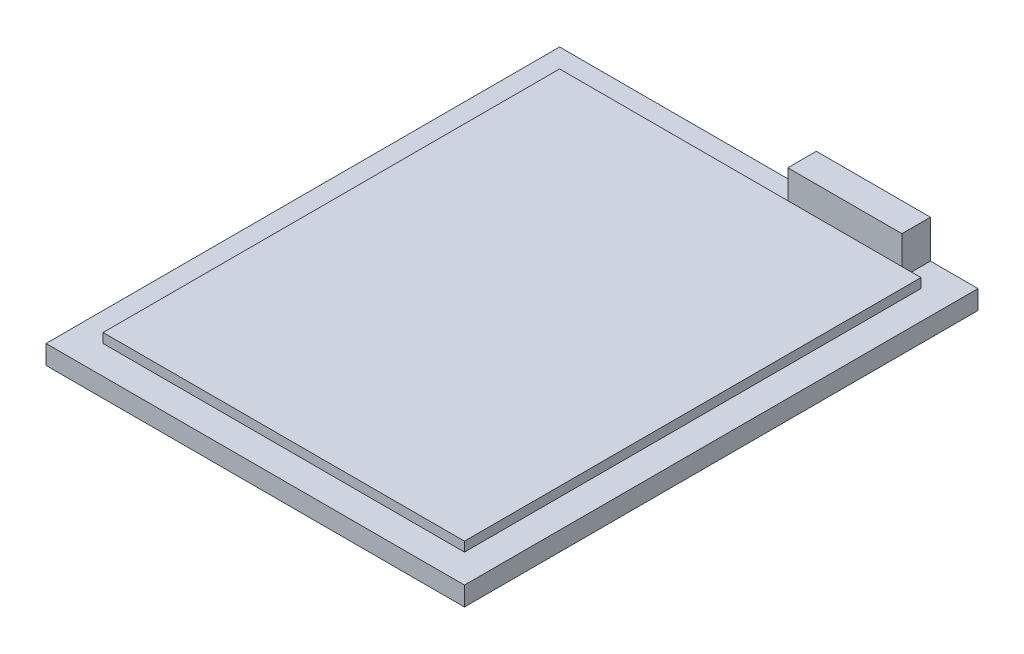
ISO-10303-21;
HEADER;
FILE_DESCRIPTION(('STEP AP214'),'2;1');
FILE_NAME('part.step','',(''),(''),'','','');
FILE_SCHEMA(('AUTOMOTIVE_DESIGN { 1 0 10303 214 1 1 1 1 }'));
ENDSEC;
DATA;
#1=APPLICATION_CONTEXT('core data for automotive mechanical design processes');
#2=APPLICATION_PROTOCOL_DEFINITION('international standard','automotive_design',2000,#1);
#3=PRODUCT_CONTEXT('',#1,'mechanical');
#4=PRODUCT('Part','Part','',(#3));
#5=PRODUCT_RELATED_PRODUCT_CATEGORY('part','',(#4));
#6=PRODUCT_DEFINITION_FORMATION('','',#4);
#7=PRODUCT_DEFINITION_CONTEXT('part definition',#1,'design');
#8=PRODUCT_DEFINITION('design','',#6,#7);
#9=PRODUCT_DEFINITION_SHAPE('','',#8);
#10=(LENGTH_UNIT() NAMED_UNIT(*) SI_UNIT(.MILLI.,.METRE.));
#11=(NAMED_UNIT(*) PLANE_ANGLE_UNIT() SI_UNIT($,.RADIAN.));
#12=(NAMED_UNIT(*) SI_UNIT($,.STERADIAN.) SOLID_ANGLE_UNIT());
#13=UNCERTAINTY_MEASURE_WITH_UNIT(LENGTH_MEASURE(1.E-05),#10,'distance_accuracy_value','');
#14=(GEOMETRIC_REPRESENTATION_CONTEXT(3) GLOBAL_UNCERTAINTY_ASSIGNED_CONTEXT((#13)) GLOBAL_UNIT_ASSIGNED_CONTEXT((#10,
#11,#12)) REPRESENTATION_CONTEXT('',''));
#15=CARTESIAN_POINT('',(0.,0.,0.));
#16=DIRECTION('',(0.,0.,1.));
#17=DIRECTION('',(1.,0.,0.));
#18=AXIS2_PLACEMENT_3D('',#15,#16,#17);
#19=CARTESIAN_POINT('',(0.,2.,0.));
#20=DIRECTION('',(0.,1.,0.));
#21=DIRECTION('',(0.,0.,1.));
#22=AXIS2_PLACEMENT_3D('',#19,#20,#21);
#23=PLANE('',#22);
#24=DIRECTION('',(-1.,0.,0.));
#25=VECTOR('',#24,1.);
#26=CARTESIAN_POINT('',(-9.07192629460979,2.,-15.9701698915296));
#27=LINE('',#26,#25);
#28=CARTESIAN_POINT('',(14.9280737053902,2.,-15.9701698915296));
#29=VERTEX_POINT('',#28);
#30=CARTESIAN_POINT('',(-9.07192629460979,2.,-15.9701698915296));
#31=VERTEX_POINT('',#30);
#32=EDGE_CURVE('E175',#29,#31,#27,.T.);
#33=ORIENTED_EDGE('',*,*,#32,.F.);
#34=DIRECTION('',(0.,0.,1.));
#35=VECTOR('',#34,1.);
#36=CARTESIAN_POINT('',(14.9280737053902,2.,-15.9701698915296));
#37=LINE('',#36,#35);
#38=CARTESIAN_POINT('',(14.9280737053902,2.,-18.9701698915296));
#39=VERTEX_POINT('',#38);
#40=EDGE_CURVE('E233',#39,#29,#37,.T.);
#41=ORIENTED_EDGE('',*,*,#40,.F.);
#42=DIRECTION('',(-1.,0.,0.));
#43=VECTOR('',#42,1.);
#44=CARTESIAN_POINT('',(-12.0719262946098,2.,-18.9701698915296));
#45=LINE('',#44,#43);
#46=CARTESIAN_POINT('',(-12.0719262946098,2.,-18.9701698915296));
#47=VERTEX_POINT('',#46);
#48=EDGE_CURVE('E194',#39,#47,#45,.T.);
#49=ORIENTED_EDGE('',*,*,#48,.T.);
#50=DIRECTION('',(0.,0.,1.));
#51=VECTOR('',#50,1.);
#52=CARTESIAN_POINT('',(-12.0719262946098,2.,-18.9701698915296));
#53=LINE('',#52,#51);
#54=CARTESIAN_POINT('',(-12.0719262946098,2.,35.0298301084704));
#55=VERTEX_POINT('',#54);
#56=EDGE_CURVE('E186',#47,#55,#53,.T.);
#57=ORIENTED_EDGE('',*,*,#56,.T.);
#58=DIRECTION('',(1.,0.,0.));
#59=VECTOR('',#58,1.);
#60=CARTESIAN_POINT('',(-12.0719262946098,2.,35.0298301084704));
#61=LINE('',#60,#59);
#62=CARTESIAN_POINT('',(31.9280737053902,2.,35.0298301084704));
#63=VERTEX_POINT('',#62);
#64=EDGE_CURVE('E189',#55,#63,#61,.T.);
#65=ORIENTED_EDGE('',*,*,#64,.T.);
#66=DIRECTION('',(0.,0.,-1.));
#67=VECTOR('',#66,1.);
#68=CARTESIAN_POINT('',(31.9280737053902,2.,-18.9701698915296));
#69=LINE('',#68,#67);
#70=CARTESIAN_POINT('',(31.9280737053902,2.,-18.9701698915296));
#71=VERTEX_POINT('',#70);
#72=EDGE_CURVE('E192',#63,#71,#69,.T.);
#73=ORIENTED_EDGE('',*,*,#72,.T.);
#74=CARTESIAN_POINT('',(26.9280737053902,2.,-18.9701698915296));
#75=VERTEX_POINT('',#74);
#76=EDGE_CURVE('E195',#71,#75,#45,.T.);
#77=ORIENTED_EDGE('',*,*,#76,.T.);
#78=DIRECTION('',(0.,0.,-1.));
#79=VECTOR('',#78,1.);
#80=CARTESIAN_POINT('',(26.9280737053902,2.,-15.9701698915296));
#81=LINE('',#80,#79);
#82=CARTESIAN_POINT('',(26.9280737053902,2.,-15.9701698915296));
#83=VERTEX_POINT('',#82);
#84=EDGE_CURVE('E144',#83,#75,#81,.T.);
#85=ORIENTED_EDGE('',*,*,#84,.F.);
#86=CARTESIAN_POINT('',(28.9280737053902,2.,-15.9701698915296));
#87=VERTEX_POINT('',#86);
#88=EDGE_CURVE('E162',#87,#83,#27,.T.);
#89=ORIENTED_EDGE('',*,*,#88,.F.);
#90=DIRECTION('',(0.,0.,-1.));
#91=VECTOR('',#90,1.);
#92=CARTESIAN_POINT('',(28.9280737053902,2.,-15.9701698915296));
#93=LINE('',#92,#91);
#94=CARTESIAN_POINT('',(28.9280737053902,2.,32.0298301084704));
#95=VERTEX_POINT('',#94);
#96=EDGE_CURVE('E173',#95,#87,#93,.T.);
#97=ORIENTED_EDGE('',*,*,#96,.F.);
#98=DIRECTION('',(1.,0.,0.));
#99=VECTOR('',#98,1.);
#100=CARTESIAN_POINT('',(-9.07192629460979,2.,32.0298301084704));
#101=LINE('',#100,#99);
#102=CARTESIAN_POINT('',(-9.07192629460979,2.,32.0298301084704));
#103=VERTEX_POINT('',#102);
#104=EDGE_CURVE('E153',#103,#95,#101,.T.);
#105=ORIENTED_EDGE('',*,*,#104,.F.);
#106=DIRECTION('',(0.,0.,1.));
#107=VECTOR('',#106,1.);
#108=CARTESIAN_POINT('',(-9.07192629460979,2.,-15.9701698915296));
#109=LINE('',#108,#107);
#110=EDGE_CURVE('E150',#31,#103,#109,.T.);
#111=ORIENTED_EDGE('',*,*,#110,.F.);
#112=EDGE_LOOP('',(#33,#41,#49,#57,#65,#73,#77,#85,#89,#97,#105,#111));
#113=FACE_BOUND('',#112,.T.);
#114=ADVANCED_FACE('F33',(#113),#23,.T.);
#115=CARTESIAN_POINT('',(-9.07192629460979,3.,-15.9701698915296));
#116=DIRECTION('',(0.,0.,1.));
#117=DIRECTION('',(1.,0.,0.));
#118=AXIS2_PLACEMENT_3D('',#115,#116,#117);
#119=PLANE('',#118);
#120=DIRECTION('',(0.,-1.,0.));
#121=VECTOR('',#120,1.);
#122=CARTESIAN_POINT('',(14.9280737053902,6.,-15.9701698915296));
#123=LINE('',#122,#121);
#124=CARTESIAN_POINT('',(14.9280737053902,3.,-15.9701698915296));
#125=VERTEX_POINT('',#124);
#126=EDGE_CURVE('E148',#125,#29,#123,.T.);
#127=ORIENTED_EDGE('',*,*,#126,.T.);
#128=ORIENTED_EDGE('',*,*,#32,.T.);
#129=DIRECTION('',(0.,-1.,0.));
#130=VECTOR('',#129,1.);
#131=CARTESIAN_POINT('',(-9.07192629460979,3.,-15.9701698915296));
#132=LINE('',#131,#130);
#133=CARTESIAN_POINT('',(-9.07192629460979,3.,-15.9701698915296));
#134=VERTEX_POINT('',#133);
#135=EDGE_CURVE('E169',#134,#31,#132,.T.);
#136=ORIENTED_EDGE('',*,*,#135,.F.);
#137=DIRECTION('',(-1.,0.,0.));
#138=VECTOR('',#137,1.);
#139=CARTESIAN_POINT('',(-9.07192629460979,3.,-15.9701698915296));
#140=LINE('',#139,#138);
#141=EDGE_CURVE('E166',#125,#134,#140,.T.);
#142=ORIENTED_EDGE('',*,*,#141,.F.);
#143=EDGE_LOOP('',(#127,#128,#136,#142));
#144=FACE_BOUND('',#143,.T.);
#145=ADVANCED_FACE('F268',(#144),#119,.F.);
#146=DIRECTION('',(0.,-1.,0.));
#147=VECTOR('',#146,1.);
#148=CARTESIAN_POINT('',(26.9280737053902,6.,-15.9701698915296));
#149=LINE('',#148,#147);
#150=CARTESIAN_POINT('',(26.9280737053902,3.,-15.9701698915296));
#151=VERTEX_POINT('',#150);
#152=EDGE_CURVE('E238',#151,#83,#149,.T.);
#153=ORIENTED_EDGE('',*,*,#152,.F.);
#154=CARTESIAN_POINT('',(28.9280737053902,3.,-15.9701698915296));
#155=VERTEX_POINT('',#154);
#156=EDGE_CURVE('E167',#155,#151,#140,.T.);
#157=ORIENTED_EDGE('',*,*,#156,.F.);
#158=DIRECTION('',(0.,-1.,0.));
#159=VECTOR('',#158,1.);
#160=CARTESIAN_POINT('',(28.9280737053902,3.,-15.9701698915296));
#161=LINE('',#160,#159);
#162=EDGE_CURVE('E56',#155,#87,#161,.T.);
#163=ORIENTED_EDGE('',*,*,#162,.T.);
#164=ORIENTED_EDGE('',*,*,#88,.T.);
#165=EDGE_LOOP('',(#153,#157,#163,#164));
#166=FACE_BOUND('',#165,.T.);
#167=ADVANCED_FACE('F250',(#166),#119,.F.);
#168=CARTESIAN_POINT('',(-12.0719262946098,2.,-18.9701698915296));
#169=DIRECTION('',(1.,0.,0.));
#170=DIRECTION('',(0.,0.,-1.));
#171=AXIS2_PLACEMENT_3D('',#168,#169,#170);
#172=PLANE('',#171);
#173=DIRECTION('',(0.,0.,1.));
#174=VECTOR('',#173,1.);
#175=CARTESIAN_POINT('',(-12.0719262946098,0.,-18.9701698915296));
#176=LINE('',#175,#174);
#177=CARTESIAN_POINT('',(-12.0719262946098,0.,-18.9701698915296));
#178=VERTEX_POINT('',#177);
#179=CARTESIAN_POINT('',(-12.0719262946098,0.,35.0298301084704));
#180=VERTEX_POINT('',#179);
#181=EDGE_CURVE('E185',#178,#180,#176,.T.);
#182=ORIENTED_EDGE('',*,*,#181,.T.);
#183=DIRECTION('',(0.,-1.,0.));
#184=VECTOR('',#183,1.);
#185=CARTESIAN_POINT('',(-12.0719262946098,2.,35.0298301084704));
#186=LINE('',#185,#184);
#187=EDGE_CURVE('E11',#55,#180,#186,.T.);
#188=ORIENTED_EDGE('',*,*,#187,.F.);
#189=ORIENTED_EDGE('',*,*,#56,.F.);
#190=DIRECTION('',(0.,-1.,0.));
#191=VECTOR('',#190,1.);
#192=CARTESIAN_POINT('',(-12.0719262946098,2.,-18.9701698915296));
#193=LINE('',#192,#191);
#194=EDGE_CURVE('E198',#47,#178,#193,.T.);
#195=ORIENTED_EDGE('',*,*,#194,.T.);
#196=EDGE_LOOP('',(#182,#188,#189,#195));
#197=FACE_BOUND('',#196,.T.);
#198=ADVANCED_FACE('F35',(#197),#172,.F.);
#199=CARTESIAN_POINT('',(-12.0719262946098,2.,35.0298301084704));
#200=DIRECTION('',(0.,0.,-1.));
#201=DIRECTION('',(-1.,0.,0.));
#202=AXIS2_PLACEMENT_3D('',#199,#200,#201);
#203=PLANE('',#202);
#204=DIRECTION('',(1.,0.,0.));
#205=VECTOR('',#204,1.);
#206=CARTESIAN_POINT('',(-12.0719262946098,0.,35.0298301084704));
#207=LINE('',#206,#205);
#208=CARTESIAN_POINT('',(31.9280737053902,0.,35.0298301084704));
#209=VERTEX_POINT('',#208);
#210=EDGE_CURVE('E201',#180,#209,#207,.T.);
#211=ORIENTED_EDGE('',*,*,#210,.T.);
#212=DIRECTION('',(0.,-1.,0.));
#213=VECTOR('',#212,1.);
#214=CARTESIAN_POINT('',(31.9280737053902,2.,35.0298301084704));
#215=LINE('',#214,#213);
#216=EDGE_CURVE('E41',#63,#209,#215,.T.);
#217=ORIENTED_EDGE('',*,*,#216,.F.);
#218=ORIENTED_EDGE('',*,*,#64,.F.);
#219=ORIENTED_EDGE('',*,*,#187,.T.);
#220=EDGE_LOOP('',(#211,#217,#218,#219));
#221=FACE_BOUND('',#220,.T.);
#222=ADVANCED_FACE('F290',(#221),#203,.F.);
#223=CARTESIAN_POINT('',(31.9280737053902,2.,-18.9701698915296));
#224=DIRECTION('',(-1.,0.,0.));
#225=DIRECTION('',(0.,0.,1.));
#226=AXIS2_PLACEMENT_3D('',#223,#224,#225);
#227=PLANE('',#226);
#228=DIRECTION('',(0.,0.,-1.));
#229=VECTOR('',#228,1.);
#230=CARTESIAN_POINT('',(31.9280737053902,0.,-18.9701698915296));
#231=LINE('',#230,#229);
#232=CARTESIAN_POINT('',(31.9280737053902,0.,-18.9701698915296));
#233=VERTEX_POINT('',#232);
#234=EDGE_CURVE('E203',#209,#233,#231,.T.);
#235=ORIENTED_EDGE('',*,*,#234,.T.);
#236=DIRECTION('',(0.,-1.,0.));
#237=VECTOR('',#236,1.);
#238=CARTESIAN_POINT('',(31.9280737053902,2.,-18.9701698915296));
#239=LINE('',#238,#237);
#240=EDGE_CURVE('E208',#71,#233,#239,.T.);
#241=ORIENTED_EDGE('',*,*,#240,.F.);
#242=ORIENTED_EDGE('',*,*,#72,.F.);
#243=ORIENTED_EDGE('',*,*,#216,.T.);
#244=EDGE_LOOP('',(#235,#241,#242,#243));
#245=FACE_BOUND('',#244,.T.);
#246=ADVANCED_FACE('F215',(#245),#227,.F.);
#247=CARTESIAN_POINT('',(-12.0719262946098,2.,-18.9701698915296));
#248=DIRECTION('',(0.,0.,1.));
#249=DIRECTION('',(1.,0.,0.));
#250=AXIS2_PLACEMENT_3D('',#247,#248,#249);
#251=PLANE('',#250);
#252=DIRECTION('',(-1.,0.,0.));
#253=VECTOR('',#252,1.);
#254=CARTESIAN_POINT('',(-12.0719262946098,0.,-18.9701698915296));
#255=LINE('',#254,#253);
#256=EDGE_CURVE('E190',#233,#178,#255,.T.);
#257=ORIENTED_EDGE('',*,*,#256,.T.);
#258=ORIENTED_EDGE('',*,*,#194,.F.);
#259=ORIENTED_EDGE('',*,*,#48,.F.);
#260=DIRECTION('',(0.,-1.,0.));
#261=VECTOR('',#260,1.);
#262=CARTESIAN_POINT('',(14.9280737053902,6.,-18.9701698915296));
#263=LINE('',#262,#261);
#264=CARTESIAN_POINT('',(14.9280737053902,6.,-18.9701698915296));
#265=VERTEX_POINT('',#264);
#266=EDGE_CURVE('E234',#265,#39,#263,.T.);
#267=ORIENTED_EDGE('',*,*,#266,.F.);
#268=DIRECTION('',(-1.,0.,0.));
#269=VECTOR('',#268,1.);
#270=CARTESIAN_POINT('',(14.9280737053902,6.,-18.9701698915296));
#271=LINE('',#270,#269);
#272=CARTESIAN_POINT('',(26.9280737053902,6.,-18.9701698915296));
#273=VERTEX_POINT('',#272);
#274=EDGE_CURVE('E141',#273,#265,#271,.T.);
#275=ORIENTED_EDGE('',*,*,#274,.F.);
#276=DIRECTION('',(0.,-1.,0.));
#277=VECTOR('',#276,1.);
#278=CARTESIAN_POINT('',(26.9280737053902,6.,-18.9701698915296));
#279=LINE('',#278,#277);
#280=EDGE_CURVE('E236',#273,#75,#279,.T.);
#281=ORIENTED_EDGE('',*,*,#280,.T.);
#282=ORIENTED_EDGE('',*,*,#76,.F.);
#283=ORIENTED_EDGE('',*,*,#240,.T.);
#284=EDGE_LOOP('',(#257,#258,#259,#267,#275,#281,#282,#283));
#285=FACE_BOUND('',#284,.T.);
#286=ADVANCED_FACE('F224',(#285),#251,.F.);
#287=CARTESIAN_POINT('',(0.,0.,0.));
#288=DIRECTION('',(0.,1.,0.));
#289=DIRECTION('',(0.,0.,1.));
#290=AXIS2_PLACEMENT_3D('',#287,#288,#289);
#291=PLANE('',#290);
#292=ORIENTED_EDGE('',*,*,#181,.F.);
#293=ORIENTED_EDGE('',*,*,#256,.F.);
#294=ORIENTED_EDGE('',*,*,#234,.F.);
#295=ORIENTED_EDGE('',*,*,#210,.F.);
#296=EDGE_LOOP('',(#292,#293,#294,#295));
#297=FACE_BOUND('',#296,.T.);
#298=ADVANCED_FACE('F221',(#297),#291,.F.);
#299=CARTESIAN_POINT('',(-9.07192629460979,3.,-15.9701698915296));
#300=DIRECTION('',(1.,0.,0.));
#301=DIRECTION('',(0.,0.,-1.));
#302=AXIS2_PLACEMENT_3D('',#299,#300,#301);
#303=PLANE('',#302);
#304=ORIENTED_EDGE('',*,*,#110,.T.);
#305=DIRECTION('',(0.,-1.,0.));
#306=VECTOR('',#305,1.);
#307=CARTESIAN_POINT('',(-9.07192629460979,3.,32.0298301084704));
#308=LINE('',#307,#306);
#309=CARTESIAN_POINT('',(-9.07192629460979,3.,32.0298301084704));
#310=VERTEX_POINT('',#309);
#311=EDGE_CURVE('E183',#310,#103,#308,.T.);
#312=ORIENTED_EDGE('',*,*,#311,.F.);
#313=DIRECTION('',(0.,0.,1.));
#314=VECTOR('',#313,1.);
#315=CARTESIAN_POINT('',(-9.07192629460979,3.,-15.9701698915296));
#316=LINE('',#315,#314);
#317=EDGE_CURVE('E158',#134,#310,#316,.T.);
#318=ORIENTED_EDGE('',*,*,#317,.F.);
#319=ORIENTED_EDGE('',*,*,#135,.T.);
#320=EDGE_LOOP('',(#304,#312,#318,#319));
#321=FACE_BOUND('',#320,.T.);
#322=ADVANCED_FACE('F265',(#321),#303,.F.);
#323=CARTESIAN_POINT('',(-9.07192629460979,3.,32.0298301084704));
#324=DIRECTION('',(0.,0.,-1.));
#325=DIRECTION('',(-1.,0.,0.));
#326=AXIS2_PLACEMENT_3D('',#323,#324,#325);
#327=PLANE('',#326);
#328=ORIENTED_EDGE('',*,*,#104,.T.);
#329=DIRECTION('',(0.,-1.,0.));
#330=VECTOR('',#329,1.);
#331=CARTESIAN_POINT('',(28.9280737053902,3.,32.0298301084704));
#332=LINE('',#331,#330);
#333=CARTESIAN_POINT('',(28.9280737053902,3.,32.0298301084704));
#334=VERTEX_POINT('',#333);
#335=EDGE_CURVE('E180',#334,#95,#332,.T.);
#336=ORIENTED_EDGE('',*,*,#335,.F.);
#337=DIRECTION('',(1.,0.,0.));
#338=VECTOR('',#337,1.);
#339=CARTESIAN_POINT('',(-9.07192629460979,3.,32.0298301084704));
#340=LINE('',#339,#338);
#341=EDGE_CURVE('E161',#310,#334,#340,.T.);
#342=ORIENTED_EDGE('',*,*,#341,.F.);
#343=ORIENTED_EDGE('',*,*,#311,.T.);
#344=EDGE_LOOP('',(#328,#336,#342,#343));
#345=FACE_BOUND('',#344,.T.);
#346=ADVANCED_FACE('F261',(#345),#327,.F.);
#347=CARTESIAN_POINT('',(28.9280737053902,3.,-15.9701698915296));
#348=DIRECTION('',(-1.,0.,0.));
#349=DIRECTION('',(0.,0.,1.));
#350=AXIS2_PLACEMENT_3D('',#347,#348,#349);
#351=PLANE('',#350);
#352=ORIENTED_EDGE('',*,*,#96,.T.);
#353=ORIENTED_EDGE('',*,*,#162,.F.);
#354=DIRECTION('',(0.,0.,-1.));
#355=VECTOR('',#354,1.);
#356=CARTESIAN_POINT('',(28.9280737053902,3.,-15.9701698915296));
#357=LINE('',#356,#355);
#358=EDGE_CURVE('E164',#334,#155,#357,.T.);
#359=ORIENTED_EDGE('',*,*,#358,.F.);
#360=ORIENTED_EDGE('',*,*,#335,.T.);
#361=EDGE_LOOP('',(#352,#353,#359,#360));
#362=FACE_BOUND('',#361,.T.);
#363=ADVANCED_FACE('F257',(#362),#351,.F.);
#364=CARTESIAN_POINT('',(0.,3.,0.));
#365=DIRECTION('',(0.,1.,0.));
#366=DIRECTION('',(0.,0.,1.));
#367=AXIS2_PLACEMENT_3D('',#364,#365,#366);
#368=PLANE('',#367);
#369=ORIENTED_EDGE('',*,*,#317,.T.);
#370=ORIENTED_EDGE('',*,*,#341,.T.);
#371=ORIENTED_EDGE('',*,*,#358,.T.);
#372=ORIENTED_EDGE('',*,*,#156,.T.);
#373=EDGE_CURVE('E170',#151,#125,#140,.T.);
#374=ORIENTED_EDGE('',*,*,#373,.T.);
#375=ORIENTED_EDGE('',*,*,#141,.T.);
#376=EDGE_LOOP('',(#369,#370,#371,#372,#374,#375));
#377=FACE_BOUND('',#376,.T.);
#378=ADVANCED_FACE('F253',(#377),#368,.T.);
#379=CARTESIAN_POINT('',(14.9280737053902,6.,-15.9701698915296));
#380=DIRECTION('',(1.,0.,0.));
#381=DIRECTION('',(0.,0.,-1.));
#382=AXIS2_PLACEMENT_3D('',#379,#380,#381);
#383=PLANE('',#382);
#384=ORIENTED_EDGE('',*,*,#40,.T.);
#385=ORIENTED_EDGE('',*,*,#126,.F.);
#386=CARTESIAN_POINT('',(14.9280737053902,6.,-15.9701698915296));
#387=VERTEX_POINT('',#386);
#388=EDGE_CURVE('E48',#387,#125,#123,.T.);
#389=ORIENTED_EDGE('',*,*,#388,.F.);
#390=DIRECTION('',(0.,0.,1.));
#391=VECTOR('',#390,1.);
#392=CARTESIAN_POINT('',(14.9280737053902,6.,-15.9701698915296));
#393=LINE('',#392,#391);
#394=EDGE_CURVE('E136',#265,#387,#393,.T.);
#395=ORIENTED_EDGE('',*,*,#394,.F.);
#396=ORIENTED_EDGE('',*,*,#266,.T.);
#397=EDGE_LOOP('',(#384,#385,#389,#395,#396));
#398=FACE_BOUND('',#397,.T.);
#399=ADVANCED_FACE('F146',(#398),#383,.F.);
#400=CARTESIAN_POINT('',(14.9280737053902,6.,-15.9701698915296));
#401=DIRECTION('',(0.,0.,-1.));
#402=DIRECTION('',(-1.,0.,0.));
#403=AXIS2_PLACEMENT_3D('',#400,#401,#402);
#404=PLANE('',#403);
#405=ORIENTED_EDGE('',*,*,#373,.F.);
#406=CARTESIAN_POINT('',(26.9280737053902,6.,-15.9701698915296));
#407=VERTEX_POINT('',#406);
#408=EDGE_CURVE('E132',#407,#151,#149,.T.);
#409=ORIENTED_EDGE('',*,*,#408,.F.);
#410=DIRECTION('',(1.,0.,0.));
#411=VECTOR('',#410,1.);
#412=CARTESIAN_POINT('',(14.9280737053902,6.,-15.9701698915296));
#413=LINE('',#412,#411);
#414=EDGE_CURVE('E128',#387,#407,#413,.T.);
#415=ORIENTED_EDGE('',*,*,#414,.F.);
#416=ORIENTED_EDGE('',*,*,#388,.T.);
#417=EDGE_LOOP('',(#405,#409,#415,#416));
#418=FACE_BOUND('',#417,.T.);
#419=ADVANCED_FACE('F130',(#418),#404,.F.);
#420=CARTESIAN_POINT('',(26.9280737053902,6.,-15.9701698915296));
#421=DIRECTION('',(-1.,0.,0.));
#422=DIRECTION('',(0.,0.,1.));
#423=AXIS2_PLACEMENT_3D('',#420,#421,#422);
#424=PLANE('',#423);
#425=ORIENTED_EDGE('',*,*,#84,.T.);
#426=ORIENTED_EDGE('',*,*,#280,.F.);
#427=DIRECTION('',(0.,0.,-1.));
#428=VECTOR('',#427,1.);
#429=CARTESIAN_POINT('',(26.9280737053902,6.,-15.9701698915296));
#430=LINE('',#429,#428);
#431=EDGE_CURVE('E135',#407,#273,#430,.T.);
#432=ORIENTED_EDGE('',*,*,#431,.F.);
#433=ORIENTED_EDGE('',*,*,#408,.T.);
#434=ORIENTED_EDGE('',*,*,#152,.T.);
#435=EDGE_LOOP('',(#425,#426,#432,#433,#434));
#436=FACE_BOUND('',#435,.T.);
#437=ADVANCED_FACE('F245',(#436),#424,.F.);
#438=CARTESIAN_POINT('',(0.,6.,0.));
#439=DIRECTION('',(0.,-1.,0.));
#440=DIRECTION('',(0.,0.,-1.));
#441=AXIS2_PLACEMENT_3D('',#438,#439,#440);
#442=PLANE('',#441);
#443=ORIENTED_EDGE('',*,*,#394,.T.);
#444=ORIENTED_EDGE('',*,*,#414,.T.);
#445=ORIENTED_EDGE('',*,*,#431,.T.);
#446=ORIENTED_EDGE('',*,*,#274,.T.);
#447=EDGE_LOOP('',(#443,#444,#445,#446));
#448=FACE_BOUND('',#447,.T.);
#449=ADVANCED_FACE('F139',(#448),#442,.F.);
#450=CLOSED_SHELL('',(#114,#145,#167,#198,#222,#246,#286,#298,#322,#346,#363,#378,#399,#419,
#437,#449));
#451=MANIFOLD_SOLID_BREP('B2',#450);
#452=ADVANCED_BREP_SHAPE_REPRESENTATION('',(#18,#451),#14);
#453=SHAPE_DEFINITION_REPRESENTATION(#9,#452);
ENDSEC;
END-ISO-10303-21;
